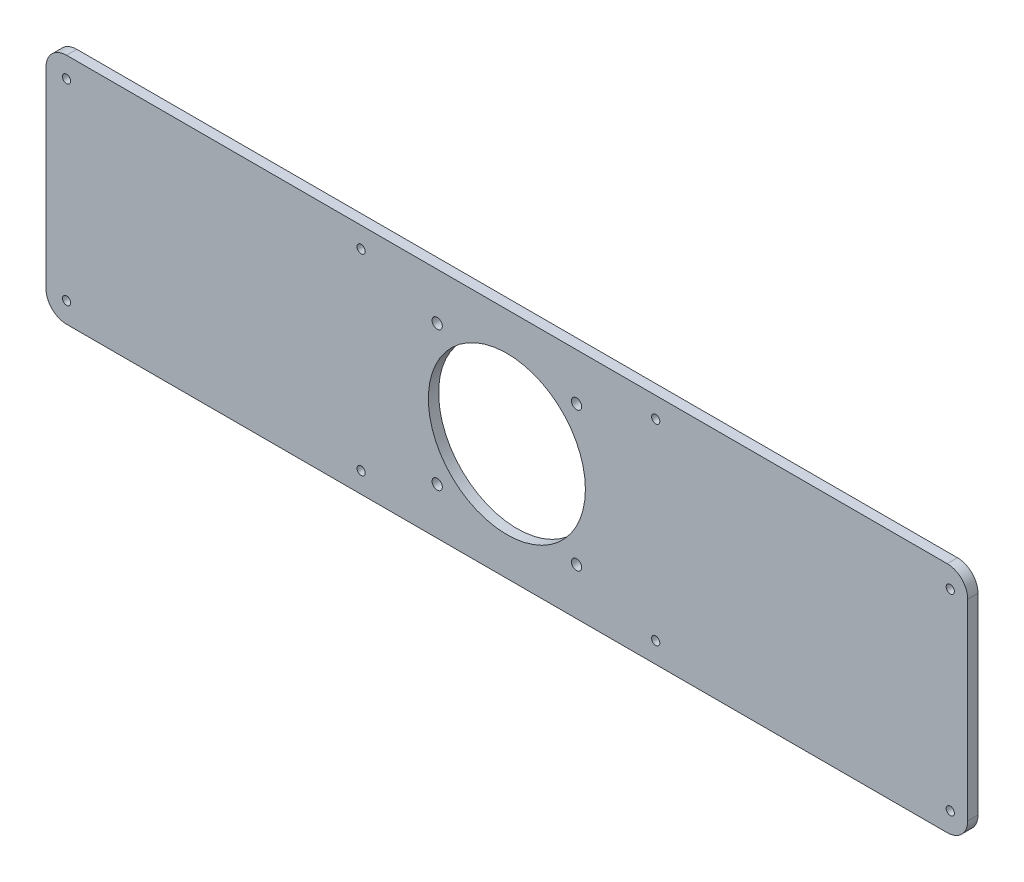
ISO-10303-21;
HEADER;
FILE_DESCRIPTION(('STEP AP214'),'2;1');
FILE_NAME('part.step','',(''),(''),'','','');
FILE_SCHEMA(('AUTOMOTIVE_DESIGN { 1 0 10303 214 1 1 1 1 }'));
ENDSEC;
DATA;
#1=APPLICATION_CONTEXT('core data for automotive mechanical design processes');
#2=APPLICATION_PROTOCOL_DEFINITION('international standard','automotive_design',2000,#1);
#3=PRODUCT_CONTEXT('',#1,'mechanical');
#4=PRODUCT('Part','Part','',(#3));
#5=PRODUCT_RELATED_PRODUCT_CATEGORY('part','',(#4));
#6=PRODUCT_DEFINITION_FORMATION('','',#4);
#7=PRODUCT_DEFINITION_CONTEXT('part definition',#1,'design');
#8=PRODUCT_DEFINITION('design','',#6,#7);
#9=PRODUCT_DEFINITION_SHAPE('','',#8);
#10=(LENGTH_UNIT() NAMED_UNIT(*) SI_UNIT(.MILLI.,.METRE.));
#11=(NAMED_UNIT(*) PLANE_ANGLE_UNIT() SI_UNIT($,.RADIAN.));
#12=(NAMED_UNIT(*) SI_UNIT($,.STERADIAN.) SOLID_ANGLE_UNIT());
#13=UNCERTAINTY_MEASURE_WITH_UNIT(LENGTH_MEASURE(1.E-05),#10,'distance_accuracy_value','');
#14=(GEOMETRIC_REPRESENTATION_CONTEXT(3) GLOBAL_UNCERTAINTY_ASSIGNED_CONTEXT((#13)) GLOBAL_UNIT_ASSIGNED_CONTEXT((#10,
#11,#12)) REPRESENTATION_CONTEXT('',''));
#15=CARTESIAN_POINT('',(0.,0.,0.));
#16=DIRECTION('',(0.,0.,1.));
#17=DIRECTION('',(1.,0.,0.));
#18=AXIS2_PLACEMENT_3D('',#15,#16,#17);
#19=CARTESIAN_POINT('',(0.,0.,5.));
#20=DIRECTION('',(0.,0.,-1.));
#21=DIRECTION('',(-1.,0.,0.));
#22=AXIS2_PLACEMENT_3D('',#19,#20,#21);
#23=PLANE('',#22);
#24=DIRECTION('',(0.,-1.,0.));
#25=VECTOR('',#24,1.);
#26=CARTESIAN_POINT('',(0.,0.,5.));
#27=LINE('',#26,#25);
#28=CARTESIAN_POINT('',(0.,103.5,5.));
#29=VERTEX_POINT('',#28);
#30=CARTESIAN_POINT('',(0.,10.,5.));
#31=VERTEX_POINT('',#30);
#32=EDGE_CURVE('E146',#29,#31,#27,.T.);
#33=ORIENTED_EDGE('',*,*,#32,.T.);
#34=CARTESIAN_POINT('',(10.,10.,5.));
#35=DIRECTION('',(0.,0.,-1.));
#36=DIRECTION('',(-1.,0.,0.));
#37=AXIS2_PLACEMENT_3D('',#34,#35,#36);
#38=CIRCLE('',#37,10.);
#39=CARTESIAN_POINT('',(10.,0.,5.));
#40=VERTEX_POINT('',#39);
#41=EDGE_CURVE('E163',#31,#40,#38,.F.);
#42=ORIENTED_EDGE('',*,*,#41,.T.);
#43=DIRECTION('',(1.,0.,0.));
#44=VECTOR('',#43,1.);
#45=CARTESIAN_POINT('',(0.,0.,5.));
#46=LINE('',#45,#44);
#47=CARTESIAN_POINT('',(439.,0.,5.));
#48=VERTEX_POINT('',#47);
#49=EDGE_CURVE('E127',#40,#48,#46,.T.);
#50=ORIENTED_EDGE('',*,*,#49,.T.);
#51=CARTESIAN_POINT('',(439.,10.,5.));
#52=DIRECTION('',(0.,0.,-1.));
#53=DIRECTION('',(-1.,0.,0.));
#54=AXIS2_PLACEMENT_3D('',#51,#52,#53);
#55=CIRCLE('',#54,10.);
#56=CARTESIAN_POINT('',(449.,10.,5.));
#57=VERTEX_POINT('',#56);
#58=EDGE_CURVE('E157',#48,#57,#55,.F.);
#59=ORIENTED_EDGE('',*,*,#58,.T.);
#60=DIRECTION('',(0.,1.,0.));
#61=VECTOR('',#60,1.);
#62=CARTESIAN_POINT('',(449.,0.,5.));
#63=LINE('',#62,#61);
#64=CARTESIAN_POINT('',(449.,103.5,5.));
#65=VERTEX_POINT('',#64);
#66=EDGE_CURVE('E173',#57,#65,#63,.T.);
#67=ORIENTED_EDGE('',*,*,#66,.T.);
#68=CARTESIAN_POINT('',(439.,103.5,5.));
#69=DIRECTION('',(0.,0.,-1.));
#70=DIRECTION('',(-1.,0.,0.));
#71=AXIS2_PLACEMENT_3D('',#68,#69,#70);
#72=CIRCLE('',#71,10.);
#73=CARTESIAN_POINT('',(439.,113.5,5.));
#74=VERTEX_POINT('',#73);
#75=EDGE_CURVE('E62',#65,#74,#72,.F.);
#76=ORIENTED_EDGE('',*,*,#75,.T.);
#77=DIRECTION('',(-1.,0.,0.));
#78=VECTOR('',#77,1.);
#79=CARTESIAN_POINT('',(0.,113.5,5.));
#80=LINE('',#79,#78);
#81=CARTESIAN_POINT('',(10.,113.5,5.));
#82=VERTEX_POINT('',#81);
#83=EDGE_CURVE('E147',#74,#82,#80,.T.);
#84=ORIENTED_EDGE('',*,*,#83,.T.);
#85=CARTESIAN_POINT('',(10.,103.5,5.));
#86=DIRECTION('',(0.,0.,-1.));
#87=DIRECTION('',(-1.,0.,0.));
#88=AXIS2_PLACEMENT_3D('',#85,#86,#87);
#89=CIRCLE('',#88,10.);
#90=EDGE_CURVE('E160',#82,#29,#89,.F.);
#91=ORIENTED_EDGE('',*,*,#90,.T.);
#92=EDGE_LOOP('',(#33,#42,#50,#59,#67,#76,#84,#91));
#93=FACE_BOUND('',#92,.T.);
#94=CARTESIAN_POINT('',(10.,10.,5.));
#95=DIRECTION('',(0.,0.,1.));
#96=DIRECTION('',(1.,0.,0.));
#97=AXIS2_PLACEMENT_3D('',#94,#95,#96);
#98=CIRCLE('',#97,2.);
#99=CARTESIAN_POINT('',(12.,10.,5.));
#100=VERTEX_POINT('',#99);
#101=EDGE_CURVE('E141',#100,#100,#98,.T.);
#102=ORIENTED_EDGE('',*,*,#101,.F.);
#103=EDGE_LOOP('',(#102));
#104=FACE_BOUND('',#103,.T.);
#105=CARTESIAN_POINT('',(153.5,10.,5.));
#106=DIRECTION('',(0.,0.,1.));
#107=DIRECTION('',(1.,0.,0.));
#108=AXIS2_PLACEMENT_3D('',#105,#106,#107);
#109=CIRCLE('',#108,2.00000000000003);
#110=CARTESIAN_POINT('',(155.5,10.,5.));
#111=VERTEX_POINT('',#110);
#112=EDGE_CURVE('E211',#111,#111,#109,.T.);
#113=ORIENTED_EDGE('',*,*,#112,.F.);
#114=EDGE_LOOP('',(#113));
#115=FACE_BOUND('',#114,.T.);
#116=CARTESIAN_POINT('',(297.,10.,5.));
#117=DIRECTION('',(0.,0.,1.));
#118=DIRECTION('',(1.,0.,0.));
#119=AXIS2_PLACEMENT_3D('',#116,#117,#118);
#120=CIRCLE('',#119,2.);
#121=CARTESIAN_POINT('',(299.,10.,5.));
#122=VERTEX_POINT('',#121);
#123=EDGE_CURVE('E216',#122,#122,#120,.T.);
#124=ORIENTED_EDGE('',*,*,#123,.F.);
#125=EDGE_LOOP('',(#124));
#126=FACE_BOUND('',#125,.T.);
#127=CARTESIAN_POINT('',(440.5,10.,5.));
#128=DIRECTION('',(0.,0.,1.));
#129=DIRECTION('',(1.,0.,0.));
#130=AXIS2_PLACEMENT_3D('',#127,#128,#129);
#131=CIRCLE('',#130,2.);
#132=CARTESIAN_POINT('',(442.5,10.,5.));
#133=VERTEX_POINT('',#132);
#134=EDGE_CURVE('E221',#133,#133,#131,.T.);
#135=ORIENTED_EDGE('',*,*,#134,.F.);
#136=EDGE_LOOP('',(#135));
#137=FACE_BOUND('',#136,.T.);
#138=CARTESIAN_POINT('',(153.5,103.5,5.));
#139=DIRECTION('',(0.,0.,1.));
#140=DIRECTION('',(1.,0.,0.));
#141=AXIS2_PLACEMENT_3D('',#138,#139,#140);
#142=CIRCLE('',#141,2.00000000000003);
#143=CARTESIAN_POINT('',(155.5,103.5,5.));
#144=VERTEX_POINT('',#143);
#145=EDGE_CURVE('E226',#144,#144,#142,.T.);
#146=ORIENTED_EDGE('',*,*,#145,.F.);
#147=EDGE_LOOP('',(#146));
#148=FACE_BOUND('',#147,.T.);
#149=CARTESIAN_POINT('',(297.,103.5,5.));
#150=DIRECTION('',(0.,0.,1.));
#151=DIRECTION('',(1.,0.,0.));
#152=AXIS2_PLACEMENT_3D('',#149,#150,#151);
#153=CIRCLE('',#152,2.);
#154=CARTESIAN_POINT('',(299.,103.5,5.));
#155=VERTEX_POINT('',#154);
#156=EDGE_CURVE('E231',#155,#155,#153,.T.);
#157=ORIENTED_EDGE('',*,*,#156,.F.);
#158=EDGE_LOOP('',(#157));
#159=FACE_BOUND('',#158,.T.);
#160=CARTESIAN_POINT('',(440.5,103.5,5.));
#161=DIRECTION('',(0.,0.,1.));
#162=DIRECTION('',(1.,0.,0.));
#163=AXIS2_PLACEMENT_3D('',#160,#161,#162);
#164=CIRCLE('',#163,2.);
#165=CARTESIAN_POINT('',(442.5,103.5,5.));
#166=VERTEX_POINT('',#165);
#167=EDGE_CURVE('E236',#166,#166,#164,.T.);
#168=ORIENTED_EDGE('',*,*,#167,.F.);
#169=EDGE_LOOP('',(#168));
#170=FACE_BOUND('',#169,.T.);
#171=CARTESIAN_POINT('',(9.99999999999997,103.5,5.));
#172=DIRECTION('',(0.,0.,1.));
#173=DIRECTION('',(1.,0.,0.));
#174=AXIS2_PLACEMENT_3D('',#171,#172,#173);
#175=CIRCLE('',#174,2.);
#176=CARTESIAN_POINT('',(12.,103.5,5.));
#177=VERTEX_POINT('',#176);
#178=EDGE_CURVE('E241',#177,#177,#175,.T.);
#179=ORIENTED_EDGE('',*,*,#178,.F.);
#180=EDGE_LOOP('',(#179));
#181=FACE_BOUND('',#180,.T.);
#182=CARTESIAN_POINT('',(224.5,56.75,5.));
#183=DIRECTION('',(0.,0.,1.));
#184=DIRECTION('',(1.,0.,0.));
#185=AXIS2_PLACEMENT_3D('',#182,#183,#184);
#186=CIRCLE('',#185,38.25);
#187=CARTESIAN_POINT('',(262.75,56.75,5.));
#188=VERTEX_POINT('',#187);
#189=EDGE_CURVE('E246',#188,#188,#186,.T.);
#190=ORIENTED_EDGE('',*,*,#189,.F.);
#191=EDGE_LOOP('',(#190));
#192=FACE_BOUND('',#191,.T.);
#193=CARTESIAN_POINT('',(258.441125496954,90.6911254969543,5.));
#194=DIRECTION('',(0.,0.,1.));
#195=DIRECTION('',(1.,0.,0.));
#196=AXIS2_PLACEMENT_3D('',#193,#194,#195);
#197=CIRCLE('',#196,2.49999999999993);
#198=CARTESIAN_POINT('',(260.941125496954,90.6911254969543,5.));
#199=VERTEX_POINT('',#198);
#200=EDGE_CURVE('E251',#199,#199,#197,.T.);
#201=ORIENTED_EDGE('',*,*,#200,.F.);
#202=EDGE_LOOP('',(#201));
#203=FACE_BOUND('',#202,.T.);
#204=CARTESIAN_POINT('',(258.441125496954,22.8088745030458,5.));
#205=DIRECTION('',(0.,0.,1.));
#206=DIRECTION('',(1.,0.,0.));
#207=AXIS2_PLACEMENT_3D('',#204,#205,#206);
#208=CIRCLE('',#207,2.50000000000002);
#209=CARTESIAN_POINT('',(260.941125496954,22.8088745030458,5.));
#210=VERTEX_POINT('',#209);
#211=EDGE_CURVE('E256',#210,#210,#208,.T.);
#212=ORIENTED_EDGE('',*,*,#211,.F.);
#213=EDGE_LOOP('',(#212));
#214=FACE_BOUND('',#213,.T.);
#215=CARTESIAN_POINT('',(190.558874503046,22.8088745030457,5.));
#216=DIRECTION('',(0.,0.,1.));
#217=DIRECTION('',(1.,0.,0.));
#218=AXIS2_PLACEMENT_3D('',#215,#216,#217);
#219=CIRCLE('',#218,2.50000000000014);
#220=CARTESIAN_POINT('',(193.058874503046,22.8088745030457,5.));
#221=VERTEX_POINT('',#220);
#222=EDGE_CURVE('E261',#221,#221,#219,.T.);
#223=ORIENTED_EDGE('',*,*,#222,.F.);
#224=EDGE_LOOP('',(#223));
#225=FACE_BOUND('',#224,.T.);
#226=CARTESIAN_POINT('',(190.558874503046,90.6911254969542,5.));
#227=DIRECTION('',(0.,0.,1.));
#228=DIRECTION('',(1.,0.,0.));
#229=AXIS2_PLACEMENT_3D('',#226,#227,#228);
#230=CIRCLE('',#229,2.5);
#231=CARTESIAN_POINT('',(193.058874503046,90.6911254969542,5.));
#232=VERTEX_POINT('',#231);
#233=EDGE_CURVE('E266',#232,#232,#230,.T.);
#234=ORIENTED_EDGE('',*,*,#233,.F.);
#235=EDGE_LOOP('',(#234));
#236=FACE_BOUND('',#235,.T.);
#237=ADVANCED_FACE('F40',(#93,#104,#115,#126,#137,#148,#159,#170,#181,#192,#203,#214,#225,#236),
#23,.F.);
#238=CARTESIAN_POINT('',(0.,0.,0.));
#239=DIRECTION('',(0.,0.,-1.));
#240=DIRECTION('',(-1.,0.,0.));
#241=AXIS2_PLACEMENT_3D('',#238,#239,#240);
#242=PLANE('',#241);
#243=CARTESIAN_POINT('',(190.558874503046,22.8088745030457,0.));
#244=DIRECTION('',(0.,0.,1.));
#245=DIRECTION('',(1.,0.,0.));
#246=AXIS2_PLACEMENT_3D('',#243,#244,#245);
#247=CIRCLE('',#246,2.50000000000014);
#248=CARTESIAN_POINT('',(193.058874503046,22.8088745030457,0.));
#249=VERTEX_POINT('',#248);
#250=EDGE_CURVE('E264',#249,#249,#247,.T.);
#251=ORIENTED_EDGE('',*,*,#250,.T.);
#252=EDGE_LOOP('',(#251));
#253=FACE_BOUND('',#252,.T.);
#254=CARTESIAN_POINT('',(258.441125496954,90.6911254969543,0.));
#255=DIRECTION('',(0.,0.,1.));
#256=DIRECTION('',(1.,0.,0.));
#257=AXIS2_PLACEMENT_3D('',#254,#255,#256);
#258=CIRCLE('',#257,2.49999999999993);
#259=CARTESIAN_POINT('',(260.941125496954,90.6911254969543,0.));
#260=VERTEX_POINT('',#259);
#261=EDGE_CURVE('E254',#260,#260,#258,.T.);
#262=ORIENTED_EDGE('',*,*,#261,.T.);
#263=EDGE_LOOP('',(#262));
#264=FACE_BOUND('',#263,.T.);
#265=CARTESIAN_POINT('',(9.99999999999997,103.5,0.));
#266=DIRECTION('',(0.,0.,1.));
#267=DIRECTION('',(1.,0.,0.));
#268=AXIS2_PLACEMENT_3D('',#265,#266,#267);
#269=CIRCLE('',#268,2.);
#270=CARTESIAN_POINT('',(12.,103.5,0.));
#271=VERTEX_POINT('',#270);
#272=EDGE_CURVE('E244',#271,#271,#269,.T.);
#273=ORIENTED_EDGE('',*,*,#272,.T.);
#274=EDGE_LOOP('',(#273));
#275=FACE_BOUND('',#274,.T.);
#276=CARTESIAN_POINT('',(297.,103.5,0.));
#277=DIRECTION('',(0.,0.,1.));
#278=DIRECTION('',(1.,0.,0.));
#279=AXIS2_PLACEMENT_3D('',#276,#277,#278);
#280=CIRCLE('',#279,2.);
#281=CARTESIAN_POINT('',(299.,103.5,0.));
#282=VERTEX_POINT('',#281);
#283=EDGE_CURVE('E234',#282,#282,#280,.T.);
#284=ORIENTED_EDGE('',*,*,#283,.T.);
#285=EDGE_LOOP('',(#284));
#286=FACE_BOUND('',#285,.T.);
#287=CARTESIAN_POINT('',(440.5,10.,0.));
#288=DIRECTION('',(0.,0.,1.));
#289=DIRECTION('',(1.,0.,0.));
#290=AXIS2_PLACEMENT_3D('',#287,#288,#289);
#291=CIRCLE('',#290,2.);
#292=CARTESIAN_POINT('',(442.5,10.,0.));
#293=VERTEX_POINT('',#292);
#294=EDGE_CURVE('E224',#293,#293,#291,.T.);
#295=ORIENTED_EDGE('',*,*,#294,.T.);
#296=EDGE_LOOP('',(#295));
#297=FACE_BOUND('',#296,.T.);
#298=CARTESIAN_POINT('',(153.5,10.,0.));
#299=DIRECTION('',(0.,0.,1.));
#300=DIRECTION('',(1.,0.,0.));
#301=AXIS2_PLACEMENT_3D('',#298,#299,#300);
#302=CIRCLE('',#301,2.00000000000003);
#303=CARTESIAN_POINT('',(155.5,10.,0.));
#304=VERTEX_POINT('',#303);
#305=EDGE_CURVE('E214',#304,#304,#302,.T.);
#306=ORIENTED_EDGE('',*,*,#305,.T.);
#307=EDGE_LOOP('',(#306));
#308=FACE_BOUND('',#307,.T.);
#309=DIRECTION('',(1.,0.,0.));
#310=VECTOR('',#309,1.);
#311=CARTESIAN_POINT('',(0.,0.,0.));
#312=LINE('',#311,#310);
#313=CARTESIAN_POINT('',(10.,0.,0.));
#314=VERTEX_POINT('',#313);
#315=CARTESIAN_POINT('',(439.,0.,0.));
#316=VERTEX_POINT('',#315);
#317=EDGE_CURVE('E124',#314,#316,#312,.T.);
#318=ORIENTED_EDGE('',*,*,#317,.F.);
#319=CARTESIAN_POINT('',(10.,10.,0.));
#320=DIRECTION('',(0.,0.,-1.));
#321=DIRECTION('',(-1.,0.,0.));
#322=AXIS2_PLACEMENT_3D('',#319,#320,#321);
#323=CIRCLE('',#322,10.);
#324=CARTESIAN_POINT('',(0.,10.,0.));
#325=VERTEX_POINT('',#324);
#326=EDGE_CURVE('E107',#314,#325,#323,.T.);
#327=ORIENTED_EDGE('',*,*,#326,.T.);
#328=DIRECTION('',(0.,-1.,0.));
#329=VECTOR('',#328,1.);
#330=CARTESIAN_POINT('',(0.,0.,0.));
#331=LINE('',#330,#329);
#332=CARTESIAN_POINT('',(0.,103.5,0.));
#333=VERTEX_POINT('',#332);
#334=EDGE_CURVE('E136',#333,#325,#331,.T.);
#335=ORIENTED_EDGE('',*,*,#334,.F.);
#336=CARTESIAN_POINT('',(10.,103.5,0.));
#337=DIRECTION('',(0.,0.,-1.));
#338=DIRECTION('',(-1.,0.,0.));
#339=AXIS2_PLACEMENT_3D('',#336,#337,#338);
#340=CIRCLE('',#339,10.);
#341=CARTESIAN_POINT('',(10.,113.5,0.));
#342=VERTEX_POINT('',#341);
#343=EDGE_CURVE('E118',#333,#342,#340,.T.);
#344=ORIENTED_EDGE('',*,*,#343,.T.);
#345=DIRECTION('',(-1.,0.,0.));
#346=VECTOR('',#345,1.);
#347=CARTESIAN_POINT('',(0.,113.5,0.));
#348=LINE('',#347,#346);
#349=CARTESIAN_POINT('',(439.,113.5,0.));
#350=VERTEX_POINT('',#349);
#351=EDGE_CURVE('E139',#350,#342,#348,.T.);
#352=ORIENTED_EDGE('',*,*,#351,.F.);
#353=CARTESIAN_POINT('',(439.,103.5,0.));
#354=DIRECTION('',(0.,0.,-1.));
#355=DIRECTION('',(-1.,0.,0.));
#356=AXIS2_PLACEMENT_3D('',#353,#354,#355);
#357=CIRCLE('',#356,10.);
#358=CARTESIAN_POINT('',(449.,103.5,0.));
#359=VERTEX_POINT('',#358);
#360=EDGE_CURVE('E128',#350,#359,#357,.T.);
#361=ORIENTED_EDGE('',*,*,#360,.T.);
#362=DIRECTION('',(0.,1.,0.));
#363=VECTOR('',#362,1.);
#364=CARTESIAN_POINT('',(449.,0.,0.));
#365=LINE('',#364,#363);
#366=CARTESIAN_POINT('',(449.,10.,0.));
#367=VERTEX_POINT('',#366);
#368=EDGE_CURVE('E135',#367,#359,#365,.T.);
#369=ORIENTED_EDGE('',*,*,#368,.F.);
#370=CARTESIAN_POINT('',(439.,10.,0.));
#371=DIRECTION('',(0.,0.,-1.));
#372=DIRECTION('',(-1.,0.,0.));
#373=AXIS2_PLACEMENT_3D('',#370,#371,#372);
#374=CIRCLE('',#373,10.);
#375=EDGE_CURVE('E134',#367,#316,#374,.T.);
#376=ORIENTED_EDGE('',*,*,#375,.T.);
#377=EDGE_LOOP('',(#318,#327,#335,#344,#352,#361,#369,#376));
#378=FACE_BOUND('',#377,.T.);
#379=CARTESIAN_POINT('',(10.,10.,0.));
#380=DIRECTION('',(0.,0.,1.));
#381=DIRECTION('',(1.,0.,0.));
#382=AXIS2_PLACEMENT_3D('',#379,#380,#381);
#383=CIRCLE('',#382,2.);
#384=CARTESIAN_POINT('',(12.,10.,0.));
#385=VERTEX_POINT('',#384);
#386=EDGE_CURVE('E197',#385,#385,#383,.T.);
#387=ORIENTED_EDGE('',*,*,#386,.T.);
#388=EDGE_LOOP('',(#387));
#389=FACE_BOUND('',#388,.T.);
#390=CARTESIAN_POINT('',(297.,10.,0.));
#391=DIRECTION('',(0.,0.,1.));
#392=DIRECTION('',(1.,0.,0.));
#393=AXIS2_PLACEMENT_3D('',#390,#391,#392);
#394=CIRCLE('',#393,2.);
#395=CARTESIAN_POINT('',(299.,10.,0.));
#396=VERTEX_POINT('',#395);
#397=EDGE_CURVE('E219',#396,#396,#394,.T.);
#398=ORIENTED_EDGE('',*,*,#397,.T.);
#399=EDGE_LOOP('',(#398));
#400=FACE_BOUND('',#399,.T.);
#401=CARTESIAN_POINT('',(153.5,103.5,0.));
#402=DIRECTION('',(0.,0.,1.));
#403=DIRECTION('',(1.,0.,0.));
#404=AXIS2_PLACEMENT_3D('',#401,#402,#403);
#405=CIRCLE('',#404,2.00000000000003);
#406=CARTESIAN_POINT('',(155.5,103.5,0.));
#407=VERTEX_POINT('',#406);
#408=EDGE_CURVE('E229',#407,#407,#405,.T.);
#409=ORIENTED_EDGE('',*,*,#408,.T.);
#410=EDGE_LOOP('',(#409));
#411=FACE_BOUND('',#410,.T.);
#412=CARTESIAN_POINT('',(440.5,103.5,0.));
#413=DIRECTION('',(0.,0.,1.));
#414=DIRECTION('',(1.,0.,0.));
#415=AXIS2_PLACEMENT_3D('',#412,#413,#414);
#416=CIRCLE('',#415,2.);
#417=CARTESIAN_POINT('',(442.5,103.5,0.));
#418=VERTEX_POINT('',#417);
#419=EDGE_CURVE('E239',#418,#418,#416,.T.);
#420=ORIENTED_EDGE('',*,*,#419,.T.);
#421=EDGE_LOOP('',(#420));
#422=FACE_BOUND('',#421,.T.);
#423=CARTESIAN_POINT('',(224.5,56.75,0.));
#424=DIRECTION('',(0.,0.,1.));
#425=DIRECTION('',(1.,0.,0.));
#426=AXIS2_PLACEMENT_3D('',#423,#424,#425);
#427=CIRCLE('',#426,38.25);
#428=CARTESIAN_POINT('',(262.75,56.75,0.));
#429=VERTEX_POINT('',#428);
#430=EDGE_CURVE('E249',#429,#429,#427,.T.);
#431=ORIENTED_EDGE('',*,*,#430,.T.);
#432=EDGE_LOOP('',(#431));
#433=FACE_BOUND('',#432,.T.);
#434=CARTESIAN_POINT('',(258.441125496954,22.8088745030458,0.));
#435=DIRECTION('',(0.,0.,1.));
#436=DIRECTION('',(1.,0.,0.));
#437=AXIS2_PLACEMENT_3D('',#434,#435,#436);
#438=CIRCLE('',#437,2.50000000000002);
#439=CARTESIAN_POINT('',(260.941125496954,22.8088745030458,0.));
#440=VERTEX_POINT('',#439);
#441=EDGE_CURVE('E259',#440,#440,#438,.T.);
#442=ORIENTED_EDGE('',*,*,#441,.T.);
#443=EDGE_LOOP('',(#442));
#444=FACE_BOUND('',#443,.T.);
#445=CARTESIAN_POINT('',(190.558874503046,90.6911254969542,0.));
#446=DIRECTION('',(0.,0.,1.));
#447=DIRECTION('',(1.,0.,0.));
#448=AXIS2_PLACEMENT_3D('',#445,#446,#447);
#449=CIRCLE('',#448,2.5);
#450=CARTESIAN_POINT('',(193.058874503046,90.6911254969542,0.));
#451=VERTEX_POINT('',#450);
#452=EDGE_CURVE('E268',#451,#451,#449,.T.);
#453=ORIENTED_EDGE('',*,*,#452,.T.);
#454=EDGE_LOOP('',(#453));
#455=FACE_BOUND('',#454,.T.);
#456=ADVANCED_FACE('F131',(#253,#264,#275,#286,#297,#308,#378,#389,#400,#411,#422,#433,#444,
#455),#242,.T.);
#457=CARTESIAN_POINT('',(0.,0.,5.));
#458=DIRECTION('',(1.,0.,0.));
#459=DIRECTION('',(0.,0.,-1.));
#460=AXIS2_PLACEMENT_3D('',#457,#458,#459);
#461=PLANE('',#460);
#462=ORIENTED_EDGE('',*,*,#334,.T.);
#463=DIRECTION('',(0.,0.,-1.));
#464=VECTOR('',#463,1.);
#465=CARTESIAN_POINT('',(0.,10.,5.));
#466=LINE('',#465,#464);
#467=EDGE_CURVE('E112',#325,#31,#466,.F.);
#468=ORIENTED_EDGE('',*,*,#467,.T.);
#469=ORIENTED_EDGE('',*,*,#32,.F.);
#470=DIRECTION('',(0.,0.,-1.));
#471=VECTOR('',#470,1.);
#472=CARTESIAN_POINT('',(0.,103.5,5.));
#473=LINE('',#472,#471);
#474=EDGE_CURVE('E117',#29,#333,#473,.T.);
#475=ORIENTED_EDGE('',*,*,#474,.T.);
#476=EDGE_LOOP('',(#462,#468,#469,#475));
#477=FACE_BOUND('',#476,.T.);
#478=ADVANCED_FACE('F190',(#477),#461,.F.);
#479=CARTESIAN_POINT('',(0.,0.,5.));
#480=DIRECTION('',(0.,1.,0.));
#481=DIRECTION('',(0.,0.,1.));
#482=AXIS2_PLACEMENT_3D('',#479,#480,#481);
#483=PLANE('',#482);
#484=ORIENTED_EDGE('',*,*,#49,.F.);
#485=DIRECTION('',(0.,0.,-1.));
#486=VECTOR('',#485,1.);
#487=CARTESIAN_POINT('',(10.,0.,5.));
#488=LINE('',#487,#486);
#489=EDGE_CURVE('E111',#40,#314,#488,.T.);
#490=ORIENTED_EDGE('',*,*,#489,.T.);
#491=ORIENTED_EDGE('',*,*,#317,.T.);
#492=DIRECTION('',(0.,0.,-1.));
#493=VECTOR('',#492,1.);
#494=CARTESIAN_POINT('',(439.,0.,5.));
#495=LINE('',#494,#493);
#496=EDGE_CURVE('E129',#316,#48,#495,.F.);
#497=ORIENTED_EDGE('',*,*,#496,.T.);
#498=EDGE_LOOP('',(#484,#490,#491,#497));
#499=FACE_BOUND('',#498,.T.);
#500=ADVANCED_FACE('F123',(#499),#483,.F.);
#501=CARTESIAN_POINT('',(449.,0.,5.));
#502=DIRECTION('',(-1.,0.,0.));
#503=DIRECTION('',(0.,0.,1.));
#504=AXIS2_PLACEMENT_3D('',#501,#502,#503);
#505=PLANE('',#504);
#506=ORIENTED_EDGE('',*,*,#66,.F.);
#507=DIRECTION('',(0.,0.,-1.));
#508=VECTOR('',#507,1.);
#509=CARTESIAN_POINT('',(449.,10.,5.));
#510=LINE('',#509,#508);
#511=EDGE_CURVE('E12',#57,#367,#510,.T.);
#512=ORIENTED_EDGE('',*,*,#511,.T.);
#513=ORIENTED_EDGE('',*,*,#368,.T.);
#514=DIRECTION('',(0.,0.,-1.));
#515=VECTOR('',#514,1.);
#516=CARTESIAN_POINT('',(449.,103.5,5.));
#517=LINE('',#516,#515);
#518=EDGE_CURVE('E48',#359,#65,#517,.F.);
#519=ORIENTED_EDGE('',*,*,#518,.T.);
#520=EDGE_LOOP('',(#506,#512,#513,#519));
#521=FACE_BOUND('',#520,.T.);
#522=ADVANCED_FACE('F172',(#521),#505,.F.);
#523=CARTESIAN_POINT('',(0.,113.5,5.));
#524=DIRECTION('',(0.,-1.,0.));
#525=DIRECTION('',(0.,0.,-1.));
#526=AXIS2_PLACEMENT_3D('',#523,#524,#525);
#527=PLANE('',#526);
#528=ORIENTED_EDGE('',*,*,#351,.T.);
#529=DIRECTION('',(0.,0.,-1.));
#530=VECTOR('',#529,1.);
#531=CARTESIAN_POINT('',(10.,113.5,5.));
#532=LINE('',#531,#530);
#533=EDGE_CURVE('E55',#342,#82,#532,.F.);
#534=ORIENTED_EDGE('',*,*,#533,.T.);
#535=ORIENTED_EDGE('',*,*,#83,.F.);
#536=DIRECTION('',(0.,0.,-1.));
#537=VECTOR('',#536,1.);
#538=CARTESIAN_POINT('',(439.,113.5,5.));
#539=LINE('',#538,#537);
#540=EDGE_CURVE('E166',#74,#350,#539,.T.);
#541=ORIENTED_EDGE('',*,*,#540,.T.);
#542=EDGE_LOOP('',(#528,#534,#535,#541));
#543=FACE_BOUND('',#542,.T.);
#544=ADVANCED_FACE('F183',(#543),#527,.F.);
#545=CARTESIAN_POINT('',(10.,10.,5.));
#546=DIRECTION('',(0.,0.,-1.));
#547=DIRECTION('',(-1.,0.,0.));
#548=AXIS2_PLACEMENT_3D('',#545,#546,#547);
#549=CYLINDRICAL_SURFACE('',#548,2.);
#550=ORIENTED_EDGE('',*,*,#101,.T.);
#551=EDGE_LOOP('',(#550));
#552=FACE_BOUND('',#551,.T.);
#553=ORIENTED_EDGE('',*,*,#386,.F.);
#554=EDGE_LOOP('',(#553));
#555=FACE_BOUND('',#554,.T.);
#556=ADVANCED_FACE('F321',(#552,#555),#549,.F.);
#557=CARTESIAN_POINT('',(153.5,10.,5.));
#558=DIRECTION('',(0.,0.,-1.));
#559=DIRECTION('',(-1.,0.,0.));
#560=AXIS2_PLACEMENT_3D('',#557,#558,#559);
#561=CYLINDRICAL_SURFACE('',#560,2.00000000000003);
#562=ORIENTED_EDGE('',*,*,#112,.T.);
#563=EDGE_LOOP('',(#562));
#564=FACE_BOUND('',#563,.T.);
#565=ORIENTED_EDGE('',*,*,#305,.F.);
#566=EDGE_LOOP('',(#565));
#567=FACE_BOUND('',#566,.T.);
#568=ADVANCED_FACE('F318',(#564,#567),#561,.F.);
#569=CARTESIAN_POINT('',(297.,10.,5.));
#570=DIRECTION('',(0.,0.,-1.));
#571=DIRECTION('',(-1.,0.,0.));
#572=AXIS2_PLACEMENT_3D('',#569,#570,#571);
#573=CYLINDRICAL_SURFACE('',#572,2.);
#574=ORIENTED_EDGE('',*,*,#123,.T.);
#575=EDGE_LOOP('',(#574));
#576=FACE_BOUND('',#575,.T.);
#577=ORIENTED_EDGE('',*,*,#397,.F.);
#578=EDGE_LOOP('',(#577));
#579=FACE_BOUND('',#578,.T.);
#580=ADVANCED_FACE('F320',(#576,#579),#573,.F.);
#581=CARTESIAN_POINT('',(440.5,10.,5.));
#582=DIRECTION('',(0.,0.,-1.));
#583=DIRECTION('',(-1.,0.,0.));
#584=AXIS2_PLACEMENT_3D('',#581,#582,#583);
#585=CYLINDRICAL_SURFACE('',#584,2.);
#586=ORIENTED_EDGE('',*,*,#134,.T.);
#587=EDGE_LOOP('',(#586));
#588=FACE_BOUND('',#587,.T.);
#589=ORIENTED_EDGE('',*,*,#294,.F.);
#590=EDGE_LOOP('',(#589));
#591=FACE_BOUND('',#590,.T.);
#592=ADVANCED_FACE('F328',(#588,#591),#585,.F.);
#593=CARTESIAN_POINT('',(153.5,103.5,5.));
#594=DIRECTION('',(0.,0.,-1.));
#595=DIRECTION('',(-1.,0.,0.));
#596=AXIS2_PLACEMENT_3D('',#593,#594,#595);
#597=CYLINDRICAL_SURFACE('',#596,2.00000000000003);
#598=ORIENTED_EDGE('',*,*,#145,.T.);
#599=EDGE_LOOP('',(#598));
#600=FACE_BOUND('',#599,.T.);
#601=ORIENTED_EDGE('',*,*,#408,.F.);
#602=EDGE_LOOP('',(#601));
#603=FACE_BOUND('',#602,.T.);
#604=ADVANCED_FACE('F490',(#600,#603),#597,.F.);
#605=CARTESIAN_POINT('',(297.,103.5,5.));
#606=DIRECTION('',(0.,0.,-1.));
#607=DIRECTION('',(-1.,0.,0.));
#608=AXIS2_PLACEMENT_3D('',#605,#606,#607);
#609=CYLINDRICAL_SURFACE('',#608,2.);
#610=ORIENTED_EDGE('',*,*,#156,.T.);
#611=EDGE_LOOP('',(#610));
#612=FACE_BOUND('',#611,.T.);
#613=ORIENTED_EDGE('',*,*,#283,.F.);
#614=EDGE_LOOP('',(#613));
#615=FACE_BOUND('',#614,.T.);
#616=ADVANCED_FACE('F480',(#612,#615),#609,.F.);
#617=CARTESIAN_POINT('',(440.5,103.5,5.));
#618=DIRECTION('',(0.,0.,-1.));
#619=DIRECTION('',(-1.,0.,0.));
#620=AXIS2_PLACEMENT_3D('',#617,#618,#619);
#621=CYLINDRICAL_SURFACE('',#620,2.);
#622=ORIENTED_EDGE('',*,*,#167,.T.);
#623=EDGE_LOOP('',(#622));
#624=FACE_BOUND('',#623,.T.);
#625=ORIENTED_EDGE('',*,*,#419,.F.);
#626=EDGE_LOOP('',(#625));
#627=FACE_BOUND('',#626,.T.);
#628=ADVANCED_FACE('F470',(#624,#627),#621,.F.);
#629=CARTESIAN_POINT('',(9.99999999999997,103.5,5.));
#630=DIRECTION('',(0.,0.,-1.));
#631=DIRECTION('',(-1.,0.,0.));
#632=AXIS2_PLACEMENT_3D('',#629,#630,#631);
#633=CYLINDRICAL_SURFACE('',#632,2.);
#634=ORIENTED_EDGE('',*,*,#178,.T.);
#635=EDGE_LOOP('',(#634));
#636=FACE_BOUND('',#635,.T.);
#637=ORIENTED_EDGE('',*,*,#272,.F.);
#638=EDGE_LOOP('',(#637));
#639=FACE_BOUND('',#638,.T.);
#640=ADVANCED_FACE('F460',(#636,#639),#633,.F.);
#641=CARTESIAN_POINT('',(224.5,56.75,5.));
#642=DIRECTION('',(0.,0.,-1.));
#643=DIRECTION('',(-1.,0.,0.));
#644=AXIS2_PLACEMENT_3D('',#641,#642,#643);
#645=CYLINDRICAL_SURFACE('',#644,38.25);
#646=ORIENTED_EDGE('',*,*,#189,.T.);
#647=EDGE_LOOP('',(#646));
#648=FACE_BOUND('',#647,.T.);
#649=ORIENTED_EDGE('',*,*,#430,.F.);
#650=EDGE_LOOP('',(#649));
#651=FACE_BOUND('',#650,.T.);
#652=ADVANCED_FACE('F450',(#648,#651),#645,.F.);
#653=CARTESIAN_POINT('',(258.441125496954,90.6911254969543,5.));
#654=DIRECTION('',(0.,0.,-1.));
#655=DIRECTION('',(-1.,0.,0.));
#656=AXIS2_PLACEMENT_3D('',#653,#654,#655);
#657=CYLINDRICAL_SURFACE('',#656,2.49999999999993);
#658=ORIENTED_EDGE('',*,*,#200,.T.);
#659=EDGE_LOOP('',(#658));
#660=FACE_BOUND('',#659,.T.);
#661=ORIENTED_EDGE('',*,*,#261,.F.);
#662=EDGE_LOOP('',(#661));
#663=FACE_BOUND('',#662,.T.);
#664=ADVANCED_FACE('F440',(#660,#663),#657,.F.);
#665=CARTESIAN_POINT('',(258.441125496954,22.8088745030458,5.));
#666=DIRECTION('',(0.,0.,-1.));
#667=DIRECTION('',(-1.,0.,0.));
#668=AXIS2_PLACEMENT_3D('',#665,#666,#667);
#669=CYLINDRICAL_SURFACE('',#668,2.50000000000002);
#670=ORIENTED_EDGE('',*,*,#211,.T.);
#671=EDGE_LOOP('',(#670));
#672=FACE_BOUND('',#671,.T.);
#673=ORIENTED_EDGE('',*,*,#441,.F.);
#674=EDGE_LOOP('',(#673));
#675=FACE_BOUND('',#674,.T.);
#676=ADVANCED_FACE('F430',(#672,#675),#669,.F.);
#677=CARTESIAN_POINT('',(190.558874503046,22.8088745030457,5.));
#678=DIRECTION('',(0.,0.,-1.));
#679=DIRECTION('',(-1.,0.,0.));
#680=AXIS2_PLACEMENT_3D('',#677,#678,#679);
#681=CYLINDRICAL_SURFACE('',#680,2.50000000000014);
#682=ORIENTED_EDGE('',*,*,#222,.T.);
#683=EDGE_LOOP('',(#682));
#684=FACE_BOUND('',#683,.T.);
#685=ORIENTED_EDGE('',*,*,#250,.F.);
#686=EDGE_LOOP('',(#685));
#687=FACE_BOUND('',#686,.T.);
#688=ADVANCED_FACE('F421',(#684,#687),#681,.F.);
#689=CARTESIAN_POINT('',(190.558874503046,90.6911254969542,5.));
#690=DIRECTION('',(0.,0.,-1.));
#691=DIRECTION('',(-1.,0.,0.));
#692=AXIS2_PLACEMENT_3D('',#689,#690,#691);
#693=CYLINDRICAL_SURFACE('',#692,2.5);
#694=ORIENTED_EDGE('',*,*,#233,.T.);
#695=EDGE_LOOP('',(#694));
#696=FACE_BOUND('',#695,.T.);
#697=ORIENTED_EDGE('',*,*,#452,.F.);
#698=EDGE_LOOP('',(#697));
#699=FACE_BOUND('',#698,.T.);
#700=ADVANCED_FACE('F351',(#696,#699),#693,.F.);
#701=CARTESIAN_POINT('',(10.,10.,5.));
#702=DIRECTION('',(0.,0.,-1.));
#703=DIRECTION('',(-1.,0.,0.));
#704=AXIS2_PLACEMENT_3D('',#701,#702,#703);
#705=CYLINDRICAL_SURFACE('',#704,10.);
#706=ORIENTED_EDGE('',*,*,#41,.F.);
#707=ORIENTED_EDGE('',*,*,#467,.F.);
#708=ORIENTED_EDGE('',*,*,#326,.F.);
#709=ORIENTED_EDGE('',*,*,#489,.F.);
#710=EDGE_LOOP('',(#706,#707,#708,#709));
#711=FACE_BOUND('',#710,.T.);
#712=ADVANCED_FACE('F110',(#711),#705,.T.);
#713=CARTESIAN_POINT('',(10.,103.5,5.));
#714=DIRECTION('',(0.,0.,-1.));
#715=DIRECTION('',(-1.,0.,0.));
#716=AXIS2_PLACEMENT_3D('',#713,#714,#715);
#717=CYLINDRICAL_SURFACE('',#716,10.);
#718=ORIENTED_EDGE('',*,*,#90,.F.);
#719=ORIENTED_EDGE('',*,*,#533,.F.);
#720=ORIENTED_EDGE('',*,*,#343,.F.);
#721=ORIENTED_EDGE('',*,*,#474,.F.);
#722=EDGE_LOOP('',(#718,#719,#720,#721));
#723=FACE_BOUND('',#722,.T.);
#724=ADVANCED_FACE('F187',(#723),#717,.T.);
#725=CARTESIAN_POINT('',(439.,10.,5.));
#726=DIRECTION('',(0.,0.,-1.));
#727=DIRECTION('',(-1.,0.,0.));
#728=AXIS2_PLACEMENT_3D('',#725,#726,#727);
#729=CYLINDRICAL_SURFACE('',#728,10.);
#730=ORIENTED_EDGE('',*,*,#58,.F.);
#731=ORIENTED_EDGE('',*,*,#496,.F.);
#732=ORIENTED_EDGE('',*,*,#375,.F.);
#733=ORIENTED_EDGE('',*,*,#511,.F.);
#734=EDGE_LOOP('',(#730,#731,#732,#733));
#735=FACE_BOUND('',#734,.T.);
#736=ADVANCED_FACE('F353',(#735),#729,.T.);
#737=CARTESIAN_POINT('',(439.,103.5,5.));
#738=DIRECTION('',(0.,0.,-1.));
#739=DIRECTION('',(-1.,0.,0.));
#740=AXIS2_PLACEMENT_3D('',#737,#738,#739);
#741=CYLINDRICAL_SURFACE('',#740,10.);
#742=ORIENTED_EDGE('',*,*,#75,.F.);
#743=ORIENTED_EDGE('',*,*,#518,.F.);
#744=ORIENTED_EDGE('',*,*,#360,.F.);
#745=ORIENTED_EDGE('',*,*,#540,.F.);
#746=EDGE_LOOP('',(#742,#743,#744,#745));
#747=FACE_BOUND('',#746,.T.);
#748=ADVANCED_FACE('F42',(#747),#741,.T.);
#749=CLOSED_SHELL('',(#237,#456,#478,#500,#522,#544,#556,#568,#580,#592,#604,#616,#628,#640,
#652,#664,#676,#688,#700,#712,#724,#736,#748));
#750=MANIFOLD_SOLID_BREP('B2',#749);
#751=ADVANCED_BREP_SHAPE_REPRESENTATION('',(#18,#750),#14);
#752=SHAPE_DEFINITION_REPRESENTATION(#9,#751);
ENDSEC;
END-ISO-10303-21;
